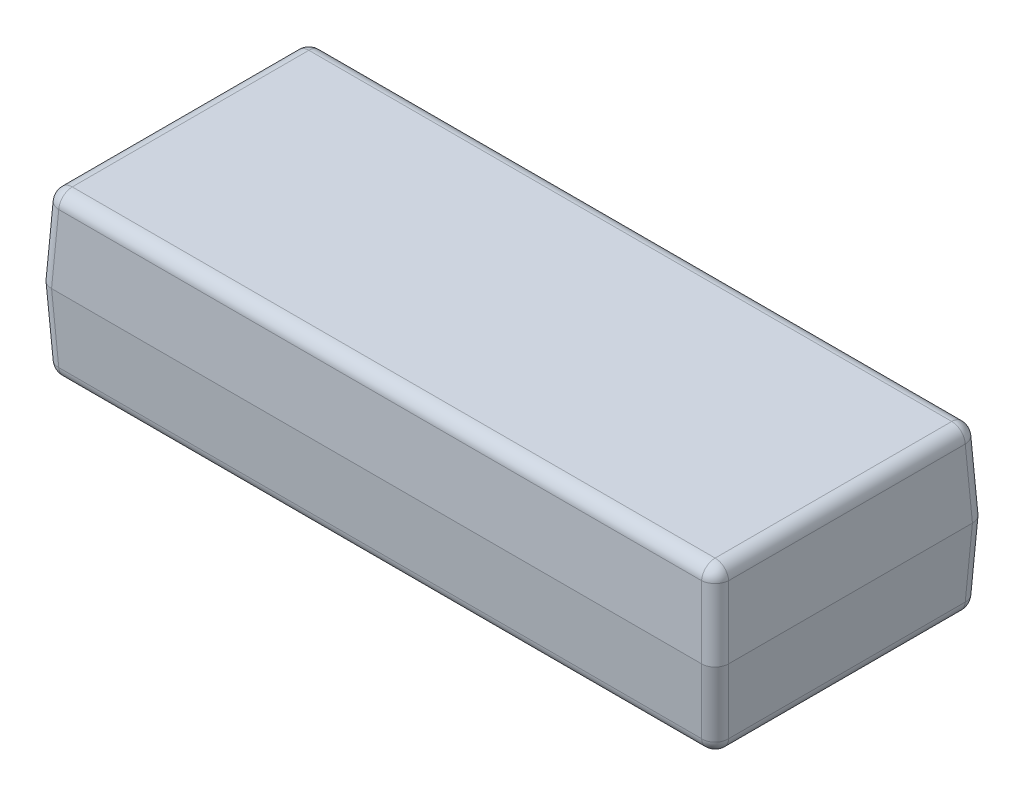
ISO-10303-21;
HEADER;
FILE_DESCRIPTION(('STEP AP214'),'2;1');
FILE_NAME('part.step','',(''),(''),'','','');
FILE_SCHEMA(('AUTOMOTIVE_DESIGN { 1 0 10303 214 1 1 1 1 }'));
ENDSEC;
DATA;
#1=APPLICATION_CONTEXT('core data for automotive mechanical design processes');
#2=APPLICATION_PROTOCOL_DEFINITION('international standard','automotive_design',2000,#1);
#3=PRODUCT_CONTEXT('',#1,'mechanical');
#4=PRODUCT('Part','Part','',(#3));
#5=PRODUCT_RELATED_PRODUCT_CATEGORY('part','',(#4));
#6=PRODUCT_DEFINITION_FORMATION('','',#4);
#7=PRODUCT_DEFINITION_CONTEXT('part definition',#1,'design');
#8=PRODUCT_DEFINITION('design','',#6,#7);
#9=PRODUCT_DEFINITION_SHAPE('','',#8);
#10=(LENGTH_UNIT() NAMED_UNIT(*) SI_UNIT(.MILLI.,.METRE.));
#11=(NAMED_UNIT(*) PLANE_ANGLE_UNIT() SI_UNIT($,.RADIAN.));
#12=(NAMED_UNIT(*) SI_UNIT($,.STERADIAN.) SOLID_ANGLE_UNIT());
#13=UNCERTAINTY_MEASURE_WITH_UNIT(LENGTH_MEASURE(1.E-05),#10,'distance_accuracy_value','');
#14=(GEOMETRIC_REPRESENTATION_CONTEXT(3) GLOBAL_UNCERTAINTY_ASSIGNED_CONTEXT((#13)) GLOBAL_UNIT_ASSIGNED_CONTEXT((#10,
#11,#12)) REPRESENTATION_CONTEXT('',''));
#15=CARTESIAN_POINT('',(0.,0.,0.));
#16=DIRECTION('',(0.,0.,1.));
#17=DIRECTION('',(1.,0.,0.));
#18=AXIS2_PLACEMENT_3D('',#15,#16,#17);
#19=CARTESIAN_POINT('',(62.5,0.,25.));
#20=DIRECTION('',(0.998629534754574,-0.0523359562429439,0.));
#21=DIRECTION('',(0.0523359562429439,0.998629534754574,0.));
#22=AXIS2_PLACEMENT_3D('',#19,#20,#21);
#23=PLANE('',#22);
#24=DIRECTION('',(0.,0.,1.));
#25=VECTOR('',#24,1.);
#26=CARTESIAN_POINT('',(62.5,0.,25.));
#27=LINE('',#26,#25);
#28=CARTESIAN_POINT('',(62.5,0.,-22.5034261631136));
#29=VERTEX_POINT('',#28);
#30=CARTESIAN_POINT('',(62.5,0.,22.5034261631136));
#31=VERTEX_POINT('',#30);
#32=EDGE_CURVE('E216',#29,#31,#27,.T.);
#33=ORIENTED_EDGE('',*,*,#32,.T.);
#34=DIRECTION('',(-0.052264427688714,-0.997264688634237,-0.052264427688714));
#35=VECTOR('',#34,1.);
#36=CARTESIAN_POINT('',(62.5068195671983,0.130125093862289,22.5102457303119));
#37=LINE('',#36,#35);
#38=CARTESIAN_POINT('',(61.8380457308536,-12.6308398906074,21.8414718939672));
#39=VERTEX_POINT('',#38);
#40=EDGE_CURVE('E12',#31,#39,#37,.T.);
#41=ORIENTED_EDGE('',*,*,#40,.T.);
#42=DIRECTION('',(0.,0.,1.));
#43=VECTOR('',#42,1.);
#44=CARTESIAN_POINT('',(61.8380457308536,-12.6308398906074,-24.2138833107544));
#45=LINE('',#44,#43);
#46=CARTESIAN_POINT('',(61.8380457308536,-12.6308398906074,-21.8414718939672));
#47=VERTEX_POINT('',#46);
#48=EDGE_CURVE('E54',#39,#47,#45,.F.);
#49=ORIENTED_EDGE('',*,*,#48,.T.);
#50=DIRECTION('',(-0.052264427688714,-0.997264688634237,0.052264427688714));
#51=VECTOR('',#50,1.);
#52=CARTESIAN_POINT('',(62.3702410471169,-2.47594831641931,-22.3736672102304));
#53=LINE('',#52,#51);
#54=EDGE_CURVE('E179',#47,#29,#53,.F.);
#55=ORIENTED_EDGE('',*,*,#54,.T.);
#56=EDGE_LOOP('',(#33,#41,#49,#55));
#57=FACE_BOUND('',#56,.T.);
#58=ADVANCED_FACE('F45',(#57),#23,.T.);
#59=CARTESIAN_POINT('',(-62.5,0.,25.));
#60=DIRECTION('',(0.,-0.0523359562429439,0.998629534754574));
#61=DIRECTION('',(0.,-0.998629534754574,-0.0523359562429439));
#62=AXIS2_PLACEMENT_3D('',#59,#60,#61);
#63=PLANE('',#62);
#64=DIRECTION('',(-1.,0.,0.));
#65=VECTOR('',#64,1.);
#66=CARTESIAN_POINT('',(-62.5,0.,25.));
#67=LINE('',#66,#65);
#68=CARTESIAN_POINT('',(60.0034261631136,0.,25.));
#69=VERTEX_POINT('',#68);
#70=CARTESIAN_POINT('',(-60.0034261631136,0.,25.));
#71=VERTEX_POINT('',#70);
#72=EDGE_CURVE('E151',#69,#71,#67,.T.);
#73=ORIENTED_EDGE('',*,*,#72,.T.);
#74=DIRECTION('',(0.052264427688714,-0.997264688634237,-0.052264427688714));
#75=VECTOR('',#74,1.);
#76=CARTESIAN_POINT('',(-60.0102457303119,0.130125093862289,25.0068195671983));
#77=LINE('',#76,#75);
#78=CARTESIAN_POINT('',(-59.3414718939672,-12.6308398906074,24.3380457308536));
#79=VERTEX_POINT('',#78);
#80=EDGE_CURVE('E177',#71,#79,#77,.T.);
#81=ORIENTED_EDGE('',*,*,#80,.T.);
#82=DIRECTION('',(-1.,0.,0.));
#83=VECTOR('',#82,1.);
#84=CARTESIAN_POINT('',(61.7138833107544,-12.6308398906074,24.3380457308536));
#85=LINE('',#84,#83);
#86=CARTESIAN_POINT('',(59.3414718939672,-12.6308398906074,24.3380457308536));
#87=VERTEX_POINT('',#86);
#88=EDGE_CURVE('E175',#79,#87,#85,.F.);
#89=ORIENTED_EDGE('',*,*,#88,.T.);
#90=DIRECTION('',(-0.052264427688714,-0.997264688634237,-0.052264427688714));
#91=VECTOR('',#90,1.);
#92=CARTESIAN_POINT('',(59.6687994301083,-6.3850584318417,24.6653732669947));
#93=LINE('',#92,#91);
#94=EDGE_CURVE('E173',#87,#69,#93,.F.);
#95=ORIENTED_EDGE('',*,*,#94,.T.);
#96=EDGE_LOOP('',(#73,#81,#89,#95));
#97=FACE_BOUND('',#96,.T.);
#98=ADVANCED_FACE('F224',(#97),#63,.T.);
#99=CARTESIAN_POINT('',(-62.5,0.,25.));
#100=DIRECTION('',(-0.998629534754574,-0.0523359562429439,0.));
#101=DIRECTION('',(0.0523359562429439,-0.998629534754574,0.));
#102=AXIS2_PLACEMENT_3D('',#99,#100,#101);
#103=PLANE('',#102);
#104=DIRECTION('',(0.,0.,-1.));
#105=VECTOR('',#104,1.);
#106=CARTESIAN_POINT('',(-62.5,0.,25.));
#107=LINE('',#106,#105);
#108=CARTESIAN_POINT('',(-62.5,0.,22.5034261631136));
#109=VERTEX_POINT('',#108);
#110=CARTESIAN_POINT('',(-62.5,0.,-22.5034261631136));
#111=VERTEX_POINT('',#110);
#112=EDGE_CURVE('E148',#109,#111,#107,.T.);
#113=ORIENTED_EDGE('',*,*,#112,.T.);
#114=DIRECTION('',(0.052264427688714,-0.997264688634237,0.052264427688714));
#115=VECTOR('',#114,1.);
#116=CARTESIAN_POINT('',(-62.3702410471169,-2.47594831641931,-22.3736672102304));
#117=LINE('',#116,#115);
#118=CARTESIAN_POINT('',(-61.8380457308536,-12.6308398906074,-21.8414718939672));
#119=VERTEX_POINT('',#118);
#120=EDGE_CURVE('E126',#111,#119,#117,.T.);
#121=ORIENTED_EDGE('',*,*,#120,.T.);
#122=DIRECTION('',(0.,0.,-1.));
#123=VECTOR('',#122,1.);
#124=CARTESIAN_POINT('',(-61.8380457308536,-12.6308398906074,24.2138833107544));
#125=LINE('',#124,#123);
#126=CARTESIAN_POINT('',(-61.8380457308536,-12.6308398906074,21.8414718939672));
#127=VERTEX_POINT('',#126);
#128=EDGE_CURVE('E161',#119,#127,#125,.F.);
#129=ORIENTED_EDGE('',*,*,#128,.T.);
#130=DIRECTION('',(0.052264427688714,-0.997264688634237,-0.052264427688714));
#131=VECTOR('',#130,1.);
#132=CARTESIAN_POINT('',(-62.5068195671983,0.130125093862289,22.5102457303119));
#133=LINE('',#132,#131);
#134=EDGE_CURVE('E131',#127,#109,#133,.F.);
#135=ORIENTED_EDGE('',*,*,#134,.T.);
#136=EDGE_LOOP('',(#113,#121,#129,#135));
#137=FACE_BOUND('',#136,.T.);
#138=ADVANCED_FACE('F257',(#137),#103,.T.);
#139=CARTESIAN_POINT('',(-62.5,0.,-25.));
#140=DIRECTION('',(0.,-0.0523359562429439,-0.998629534754574));
#141=DIRECTION('',(0.,0.998629534754574,-0.0523359562429439));
#142=AXIS2_PLACEMENT_3D('',#139,#140,#141);
#143=PLANE('',#142);
#144=DIRECTION('',(1.,0.,0.));
#145=VECTOR('',#144,1.);
#146=CARTESIAN_POINT('',(-61.7138833107544,-12.6308398906074,-24.3380457308536));
#147=LINE('',#146,#145);
#148=CARTESIAN_POINT('',(59.3414718939672,-12.6308398906074,-24.3380457308536));
#149=VERTEX_POINT('',#148);
#150=CARTESIAN_POINT('',(-59.3414718939672,-12.6308398906074,-24.3380457308536));
#151=VERTEX_POINT('',#150);
#152=EDGE_CURVE('E140',#149,#151,#147,.F.);
#153=ORIENTED_EDGE('',*,*,#152,.T.);
#154=DIRECTION('',(0.052264427688714,-0.997264688634237,0.052264427688714));
#155=VECTOR('',#154,1.);
#156=CARTESIAN_POINT('',(-60.0102457303119,0.130125093862289,-25.0068195671983));
#157=LINE('',#156,#155);
#158=CARTESIAN_POINT('',(-60.0034261631136,0.,-25.));
#159=VERTEX_POINT('',#158);
#160=EDGE_CURVE('E125',#151,#159,#157,.F.);
#161=ORIENTED_EDGE('',*,*,#160,.T.);
#162=DIRECTION('',(1.,0.,0.));
#163=VECTOR('',#162,1.);
#164=CARTESIAN_POINT('',(-62.5,0.,-25.));
#165=LINE('',#164,#163);
#166=CARTESIAN_POINT('',(60.0034261631136,0.,-25.));
#167=VERTEX_POINT('',#166);
#168=EDGE_CURVE('E137',#159,#167,#165,.T.);
#169=ORIENTED_EDGE('',*,*,#168,.T.);
#170=DIRECTION('',(-0.052264427688714,-0.997264688634237,0.052264427688714));
#171=VECTOR('',#170,1.);
#172=CARTESIAN_POINT('',(59.6687994301083,-6.3850584318417,-24.6653732669947));
#173=LINE('',#172,#171);
#174=EDGE_CURVE('E147',#167,#149,#173,.T.);
#175=ORIENTED_EDGE('',*,*,#174,.T.);
#176=EDGE_LOOP('',(#153,#161,#169,#175));
#177=FACE_BOUND('',#176,.T.);
#178=ADVANCED_FACE('F136',(#177),#143,.T.);
#179=CARTESIAN_POINT('',(0.,-15.,0.));
#180=DIRECTION('',(0.,-1.,0.));
#181=DIRECTION('',(0.,0.,-1.));
#182=AXIS2_PLACEMENT_3D('',#179,#180,#181);
#183=PLANE('',#182);
#184=DIRECTION('',(1.,0.,0.));
#185=VECTOR('',#184,1.);
#186=CARTESIAN_POINT('',(-61.7138833107544,-15.,21.8414718939672));
#187=LINE('',#186,#185);
#188=CARTESIAN_POINT('',(59.3414718939672,-15.,21.8414718939672));
#189=VERTEX_POINT('',#188);
#190=CARTESIAN_POINT('',(-59.3414718939672,-15.,21.8414718939672));
#191=VERTEX_POINT('',#190);
#192=EDGE_CURVE('E168',#189,#191,#187,.F.);
#193=ORIENTED_EDGE('',*,*,#192,.T.);
#194=DIRECTION('',(0.,0.,1.));
#195=VECTOR('',#194,1.);
#196=CARTESIAN_POINT('',(-59.3414718939672,-15.,-24.2138833107544));
#197=LINE('',#196,#195);
#198=CARTESIAN_POINT('',(-59.3414718939672,-15.,-21.8414718939672));
#199=VERTEX_POINT('',#198);
#200=EDGE_CURVE('E170',#191,#199,#197,.F.);
#201=ORIENTED_EDGE('',*,*,#200,.T.);
#202=DIRECTION('',(-1.,0.,0.));
#203=VECTOR('',#202,1.);
#204=CARTESIAN_POINT('',(61.7138833107544,-15.,-21.8414718939672));
#205=LINE('',#204,#203);
#206=CARTESIAN_POINT('',(59.3414718939672,-15.,-21.8414718939672));
#207=VERTEX_POINT('',#206);
#208=EDGE_CURVE('E164',#199,#207,#205,.F.);
#209=ORIENTED_EDGE('',*,*,#208,.T.);
#210=DIRECTION('',(0.,0.,-1.));
#211=VECTOR('',#210,1.);
#212=CARTESIAN_POINT('',(59.3414718939672,-15.,24.2138833107544));
#213=LINE('',#212,#211);
#214=EDGE_CURVE('E166',#207,#189,#213,.F.);
#215=ORIENTED_EDGE('',*,*,#214,.T.);
#216=EDGE_LOOP('',(#193,#201,#209,#215));
#217=FACE_BOUND('',#216,.T.);
#218=ADVANCED_FACE('F264',(#217),#183,.T.);
#219=CARTESIAN_POINT('',(0.,0.,0.));
#220=DIRECTION('',(0.,-1.,0.));
#221=DIRECTION('',(0.,0.,-1.));
#222=AXIS2_PLACEMENT_3D('',#219,#220,#221);
#223=PLANE('',#222);
#224=ORIENTED_EDGE('',*,*,#168,.F.);
#225=CARTESIAN_POINT('',(-59.9965691350052,0.,-22.4965691350052));
#226=DIRECTION('',(0.,-1.,0.));
#227=DIRECTION('',(-0.707106781186548,0.,-0.707106781186548));
#228=AXIS2_PLACEMENT_3D('',#225,#226,#227);
#229=ELLIPSE('',#228,2.50685703453892,2.5);
#230=EDGE_CURVE('E121',#159,#111,#229,.F.);
#231=ORIENTED_EDGE('',*,*,#230,.T.);
#232=ORIENTED_EDGE('',*,*,#112,.F.);
#233=CARTESIAN_POINT('',(-59.9965691350052,0.,22.4965691350052));
#234=DIRECTION('',(0.,-1.,0.));
#235=DIRECTION('',(-0.707106781186548,0.,0.707106781186548));
#236=AXIS2_PLACEMENT_3D('',#233,#234,#235);
#237=ELLIPSE('',#236,2.50685703453892,2.5);
#238=EDGE_CURVE('E132',#109,#71,#237,.F.);
#239=ORIENTED_EDGE('',*,*,#238,.T.);
#240=ORIENTED_EDGE('',*,*,#72,.F.);
#241=CARTESIAN_POINT('',(59.9965691350052,0.,22.4965691350052));
#242=DIRECTION('',(0.,-1.,0.));
#243=DIRECTION('',(0.707106781186548,0.,0.707106781186548));
#244=AXIS2_PLACEMENT_3D('',#241,#242,#243);
#245=ELLIPSE('',#244,2.50685703453892,2.5);
#246=EDGE_CURVE('E157',#69,#31,#245,.F.);
#247=ORIENTED_EDGE('',*,*,#246,.T.);
#248=ORIENTED_EDGE('',*,*,#32,.F.);
#249=CARTESIAN_POINT('',(59.9965691350052,0.,-22.4965691350052));
#250=DIRECTION('',(0.,-1.,0.));
#251=DIRECTION('',(0.707106781186548,0.,-0.707106781186548));
#252=AXIS2_PLACEMENT_3D('',#249,#250,#251);
#253=ELLIPSE('',#252,2.50685703453892,2.5);
#254=EDGE_CURVE('E142',#29,#167,#253,.F.);
#255=ORIENTED_EDGE('',*,*,#254,.T.);
#256=EDGE_LOOP('',(#224,#231,#232,#239,#240,#247,#248,#255));
#257=FACE_BOUND('',#256,.T.);
#258=ADVANCED_FACE('F144',(#257),#223,.F.);
#259=CARTESIAN_POINT('',(59.6687994301083,-6.25421854123434,22.1687994301083));
#260=DIRECTION('',(0.052264427688714,0.997264688634237,0.052264427688714));
#261=DIRECTION('',(0.,-0.0523359562429439,0.998629534754574));
#262=AXIS2_PLACEMENT_3D('',#259,#260,#261);
#263=CYLINDRICAL_SURFACE('',#262,2.5);
#264=CARTESIAN_POINT('',(59.3414718939672,-12.5,21.8414718939672));
#265=DIRECTION('',(-0.0522644276887138,-0.997264688634237,-0.0522644276887138));
#266=DIRECTION('',(0.,0.0523359562429437,-0.998629534754574));
#267=AXIS2_PLACEMENT_3D('',#264,#265,#266);
#268=CIRCLE('',#267,2.5);
#269=EDGE_CURVE('E49',#39,#87,#268,.T.);
#270=ORIENTED_EDGE('',*,*,#269,.F.);
#271=ORIENTED_EDGE('',*,*,#40,.F.);
#272=ORIENTED_EDGE('',*,*,#246,.F.);
#273=ORIENTED_EDGE('',*,*,#94,.F.);
#274=EDGE_LOOP('',(#270,#271,#272,#273));
#275=FACE_BOUND('',#274,.T.);
#276=ADVANCED_FACE('F47',(#275),#263,.T.);
#277=CARTESIAN_POINT('',(59.3414718939672,-12.5,21.8414718939672));
#278=DIRECTION('',(0.,0.,1.));
#279=DIRECTION('',(1.,0.,0.));
#280=AXIS2_PLACEMENT_3D('',#277,#278,#279);
#281=SPHERICAL_SURFACE('',#280,2.5);
#282=CARTESIAN_POINT('',(59.3414718939672,-12.5,21.8414718939672));
#283=DIRECTION('',(0.,0.,1.));
#284=DIRECTION('',(1.,0.,0.));
#285=AXIS2_PLACEMENT_3D('',#282,#283,#284);
#286=CIRCLE('',#285,2.5);
#287=EDGE_CURVE('E207',#39,#189,#286,.F.);
#288=ORIENTED_EDGE('',*,*,#287,.F.);
#289=ORIENTED_EDGE('',*,*,#269,.T.);
#290=CARTESIAN_POINT('',(59.3414718939672,-12.5,21.8414718939672));
#291=DIRECTION('',(1.,0.,0.));
#292=DIRECTION('',(0.,0.,-1.));
#293=AXIS2_PLACEMENT_3D('',#290,#291,#292);
#294=CIRCLE('',#293,2.5);
#295=EDGE_CURVE('E209',#189,#87,#294,.F.);
#296=ORIENTED_EDGE('',*,*,#295,.F.);
#297=EDGE_LOOP('',(#288,#289,#296));
#298=FACE_BOUND('',#297,.T.);
#299=ADVANCED_FACE('F281',(#298),#281,.T.);
#300=CARTESIAN_POINT('',(-60.0102457303119,0.260964984469648,22.5102457303119));
#301=DIRECTION('',(-0.052264427688714,0.997264688634237,0.052264427688714));
#302=DIRECTION('',(0.,-0.0523359562429439,0.998629534754574));
#303=AXIS2_PLACEMENT_3D('',#300,#301,#302);
#304=CYLINDRICAL_SURFACE('',#303,2.5);
#305=ORIENTED_EDGE('',*,*,#238,.F.);
#306=ORIENTED_EDGE('',*,*,#134,.F.);
#307=CARTESIAN_POINT('',(-59.3414718939672,-12.5,21.8414718939672));
#308=DIRECTION('',(0.0522644276887139,-0.997264688634237,-0.0522644276887139));
#309=DIRECTION('',(0.998629534754574,0.0523359562429438,0.));
#310=AXIS2_PLACEMENT_3D('',#307,#308,#309);
#311=CIRCLE('',#310,2.5);
#312=EDGE_CURVE('E204',#79,#127,#311,.T.);
#313=ORIENTED_EDGE('',*,*,#312,.F.);
#314=ORIENTED_EDGE('',*,*,#80,.F.);
#315=EDGE_LOOP('',(#305,#306,#313,#314));
#316=FACE_BOUND('',#315,.T.);
#317=ADVANCED_FACE('F230',(#316),#304,.T.);
#318=CARTESIAN_POINT('',(0.,-12.5,21.8414718939672));
#319=DIRECTION('',(-1.,0.,0.));
#320=DIRECTION('',(0.,0.,1.));
#321=AXIS2_PLACEMENT_3D('',#318,#319,#320);
#322=CYLINDRICAL_SURFACE('',#321,2.5);
#323=ORIENTED_EDGE('',*,*,#295,.T.);
#324=ORIENTED_EDGE('',*,*,#88,.F.);
#325=CARTESIAN_POINT('',(-59.3414718939672,-12.5,21.8414718939672));
#326=DIRECTION('',(-1.,0.,0.));
#327=DIRECTION('',(0.,0.,1.));
#328=AXIS2_PLACEMENT_3D('',#325,#326,#327);
#329=CIRCLE('',#328,2.5);
#330=EDGE_CURVE('E201',#191,#79,#329,.T.);
#331=ORIENTED_EDGE('',*,*,#330,.F.);
#332=ORIENTED_EDGE('',*,*,#192,.F.);
#333=EDGE_LOOP('',(#323,#324,#331,#332));
#334=FACE_BOUND('',#333,.T.);
#335=ADVANCED_FACE('F237',(#334),#322,.T.);
#336=CARTESIAN_POINT('',(59.3414718939672,-12.5,0.));
#337=DIRECTION('',(0.,0.,1.));
#338=DIRECTION('',(1.,0.,0.));
#339=AXIS2_PLACEMENT_3D('',#336,#337,#338);
#340=CYLINDRICAL_SURFACE('',#339,2.5);
#341=ORIENTED_EDGE('',*,*,#287,.T.);
#342=ORIENTED_EDGE('',*,*,#214,.F.);
#343=CARTESIAN_POINT('',(59.3414718939672,-12.5,-21.8414718939672));
#344=DIRECTION('',(0.,0.,-1.));
#345=DIRECTION('',(-1.,0.,0.));
#346=AXIS2_PLACEMENT_3D('',#343,#344,#345);
#347=CIRCLE('',#346,2.5);
#348=EDGE_CURVE('E198',#47,#207,#347,.T.);
#349=ORIENTED_EDGE('',*,*,#348,.F.);
#350=ORIENTED_EDGE('',*,*,#48,.F.);
#351=EDGE_LOOP('',(#341,#342,#349,#350));
#352=FACE_BOUND('',#351,.T.);
#353=ADVANCED_FACE('F280',(#352),#340,.T.);
#354=CARTESIAN_POINT('',(59.8736672102304,-2.34510842581195,-22.3736672102304));
#355=DIRECTION('',(0.052264427688714,0.997264688634237,-0.052264427688714));
#356=DIRECTION('',(0.,0.0523359562429439,0.998629534754574));
#357=AXIS2_PLACEMENT_3D('',#354,#355,#356);
#358=CYLINDRICAL_SURFACE('',#357,2.5);
#359=ORIENTED_EDGE('',*,*,#254,.F.);
#360=ORIENTED_EDGE('',*,*,#54,.F.);
#361=CARTESIAN_POINT('',(59.3414718939672,-12.5,-21.8414718939672));
#362=DIRECTION('',(-0.0522644276887138,-0.997264688634237,0.0522644276887138));
#363=DIRECTION('',(0.,-0.0523359562429438,-0.998629534754574));
#364=AXIS2_PLACEMENT_3D('',#361,#362,#363);
#365=CIRCLE('',#364,2.5);
#366=EDGE_CURVE('E195',#149,#47,#365,.T.);
#367=ORIENTED_EDGE('',*,*,#366,.F.);
#368=ORIENTED_EDGE('',*,*,#174,.F.);
#369=EDGE_LOOP('',(#359,#360,#367,#368));
#370=FACE_BOUND('',#369,.T.);
#371=ADVANCED_FACE('F240',(#370),#358,.T.);
#372=CARTESIAN_POINT('',(-59.3414718939672,-12.5,21.8414718939672));
#373=DIRECTION('',(0.,0.,1.));
#374=DIRECTION('',(1.,0.,0.));
#375=AXIS2_PLACEMENT_3D('',#372,#373,#374);
#376=SPHERICAL_SURFACE('',#375,2.5);
#377=ORIENTED_EDGE('',*,*,#330,.T.);
#378=ORIENTED_EDGE('',*,*,#312,.T.);
#379=CARTESIAN_POINT('',(-59.3414718939672,-12.5,21.8414718939672));
#380=DIRECTION('',(0.,0.,1.));
#381=DIRECTION('',(0.,-1.,0.));
#382=AXIS2_PLACEMENT_3D('',#379,#380,#381);
#383=CIRCLE('',#382,2.5);
#384=EDGE_CURVE('E192',#191,#127,#383,.F.);
#385=ORIENTED_EDGE('',*,*,#384,.F.);
#386=EDGE_LOOP('',(#377,#378,#385));
#387=FACE_BOUND('',#386,.T.);
#388=ADVANCED_FACE('F235',(#387),#376,.T.);
#389=CARTESIAN_POINT('',(59.3414718939672,-12.5,-21.8414718939672));
#390=DIRECTION('',(0.,0.,1.));
#391=DIRECTION('',(1.,0.,0.));
#392=AXIS2_PLACEMENT_3D('',#389,#390,#391);
#393=SPHERICAL_SURFACE('',#392,2.5);
#394=ORIENTED_EDGE('',*,*,#366,.T.);
#395=ORIENTED_EDGE('',*,*,#348,.T.);
#396=CARTESIAN_POINT('',(59.3414718939672,-12.5,-21.8414718939672));
#397=DIRECTION('',(1.,0.,0.));
#398=DIRECTION('',(0.,0.,-1.));
#399=AXIS2_PLACEMENT_3D('',#396,#397,#398);
#400=CIRCLE('',#399,2.5);
#401=EDGE_CURVE('E189',#149,#207,#400,.F.);
#402=ORIENTED_EDGE('',*,*,#401,.F.);
#403=EDGE_LOOP('',(#394,#395,#402));
#404=FACE_BOUND('',#403,.T.);
#405=ADVANCED_FACE('F245',(#404),#393,.T.);
#406=CARTESIAN_POINT('',(-59.3414718939672,-12.5,0.));
#407=DIRECTION('',(0.,0.,-1.));
#408=DIRECTION('',(-1.,0.,0.));
#409=AXIS2_PLACEMENT_3D('',#406,#407,#408);
#410=CYLINDRICAL_SURFACE('',#409,2.5);
#411=ORIENTED_EDGE('',*,*,#384,.T.);
#412=ORIENTED_EDGE('',*,*,#128,.F.);
#413=CARTESIAN_POINT('',(-59.3414718939672,-12.5,-21.8414718939672));
#414=DIRECTION('',(0.,0.,-1.));
#415=DIRECTION('',(-1.,0.,0.));
#416=AXIS2_PLACEMENT_3D('',#413,#414,#415);
#417=CIRCLE('',#416,2.5);
#418=EDGE_CURVE('E186',#199,#119,#417,.T.);
#419=ORIENTED_EDGE('',*,*,#418,.F.);
#420=ORIENTED_EDGE('',*,*,#200,.F.);
#421=EDGE_LOOP('',(#411,#412,#419,#420));
#422=FACE_BOUND('',#421,.T.);
#423=ADVANCED_FACE('F255',(#422),#410,.T.);
#424=CARTESIAN_POINT('',(0.,-12.5,-21.8414718939672));
#425=DIRECTION('',(1.,0.,0.));
#426=DIRECTION('',(0.,0.,-1.));
#427=AXIS2_PLACEMENT_3D('',#424,#425,#426);
#428=CYLINDRICAL_SURFACE('',#427,2.5);
#429=ORIENTED_EDGE('',*,*,#401,.T.);
#430=ORIENTED_EDGE('',*,*,#208,.F.);
#431=CARTESIAN_POINT('',(-59.3414718939672,-12.5,-21.8414718939672));
#432=DIRECTION('',(-1.,0.,0.));
#433=DIRECTION('',(0.,0.,1.));
#434=AXIS2_PLACEMENT_3D('',#431,#432,#433);
#435=CIRCLE('',#434,2.5);
#436=EDGE_CURVE('E184',#151,#199,#435,.T.);
#437=ORIENTED_EDGE('',*,*,#436,.F.);
#438=ORIENTED_EDGE('',*,*,#152,.F.);
#439=EDGE_LOOP('',(#429,#430,#437,#438));
#440=FACE_BOUND('',#439,.T.);
#441=ADVANCED_FACE('F248',(#440),#428,.T.);
#442=CARTESIAN_POINT('',(-59.3414718939672,-12.5,-21.8414718939672));
#443=DIRECTION('',(0.,0.,1.));
#444=DIRECTION('',(1.,0.,0.));
#445=AXIS2_PLACEMENT_3D('',#442,#443,#444);
#446=SPHERICAL_SURFACE('',#445,2.5);
#447=ORIENTED_EDGE('',*,*,#436,.T.);
#448=ORIENTED_EDGE('',*,*,#418,.T.);
#449=CARTESIAN_POINT('',(-59.3414718939672,-12.5,-21.8414718939672));
#450=DIRECTION('',(0.0522644276887138,-0.997264688634237,0.0522644276887138));
#451=DIRECTION('',(0.,-0.0523359562429438,-0.998629534754574));
#452=AXIS2_PLACEMENT_3D('',#449,#450,#451);
#453=CIRCLE('',#452,2.5);
#454=EDGE_CURVE('E182',#151,#119,#453,.F.);
#455=ORIENTED_EDGE('',*,*,#454,.F.);
#456=EDGE_LOOP('',(#447,#448,#455));
#457=FACE_BOUND('',#456,.T.);
#458=ADVANCED_FACE('F252',(#457),#446,.T.);
#459=CARTESIAN_POINT('',(-60.0102457303119,0.260964984469649,-22.5102457303119));
#460=DIRECTION('',(-0.052264427688714,0.997264688634237,-0.052264427688714));
#461=DIRECTION('',(0.,0.0523359562429439,0.998629534754574));
#462=AXIS2_PLACEMENT_3D('',#459,#460,#461);
#463=CYLINDRICAL_SURFACE('',#462,2.5);
#464=ORIENTED_EDGE('',*,*,#454,.T.);
#465=ORIENTED_EDGE('',*,*,#120,.F.);
#466=ORIENTED_EDGE('',*,*,#230,.F.);
#467=ORIENTED_EDGE('',*,*,#160,.F.);
#468=EDGE_LOOP('',(#464,#465,#466,#467));
#469=FACE_BOUND('',#468,.T.);
#470=ADVANCED_FACE('F124',(#469),#463,.T.);
#471=CLOSED_SHELL('',(#58,#98,#138,#178,#218,#258,#276,#299,#317,#335,#353,#371,#388,#405,#423,
#441,#458,#470));
#472=MANIFOLD_SOLID_BREP('B2',#471);
#473=CARTESIAN_POINT('',(62.5,0.,-25.));
#474=DIRECTION('',(0.998629534754574,0.0523359562429439,0.));
#475=DIRECTION('',(-0.0523359562429439,0.998629534754574,0.));
#476=AXIS2_PLACEMENT_3D('',#473,#474,#475);
#477=PLANE('',#476);
#478=DIRECTION('',(0.,0.,-1.));
#479=VECTOR('',#478,1.);
#480=CARTESIAN_POINT('',(61.8380457308536,12.6308398906074,24.2138833107544));
#481=LINE('',#480,#479);
#482=CARTESIAN_POINT('',(61.8380457308536,12.6308398906074,-21.8414718939672));
#483=VERTEX_POINT('',#482);
#484=CARTESIAN_POINT('',(61.8380457308536,12.6308398906074,21.8414718939672));
#485=VERTEX_POINT('',#484);
#486=EDGE_CURVE('E503',#483,#485,#481,.F.);
#487=ORIENTED_EDGE('',*,*,#486,.T.);
#488=DIRECTION('',(-0.052264427688714,0.997264688634237,-0.052264427688714));
#489=VECTOR('',#488,1.);
#490=CARTESIAN_POINT('',(62.3702410471169,2.47594831641931,22.3736672102304));
#491=LINE('',#490,#489);
#492=CARTESIAN_POINT('',(62.5,0.,22.5034261631136));
#493=VERTEX_POINT('',#492);
#494=EDGE_CURVE('E489',#485,#493,#491,.F.);
#495=ORIENTED_EDGE('',*,*,#494,.T.);
#496=DIRECTION('',(0.,0.,-1.));
#497=VECTOR('',#496,1.);
#498=CARTESIAN_POINT('',(62.5,0.,-25.));
#499=LINE('',#498,#497);
#500=CARTESIAN_POINT('',(62.5,0.,-22.5034261631136));
#501=VERTEX_POINT('',#500);
#502=EDGE_CURVE('E500',#493,#501,#499,.T.);
#503=ORIENTED_EDGE('',*,*,#502,.T.);
#504=DIRECTION('',(-0.052264427688714,0.997264688634237,0.052264427688714));
#505=VECTOR('',#504,1.);
#506=CARTESIAN_POINT('',(62.5068195671983,-0.130125093862289,-22.5102457303119));
#507=LINE('',#506,#505);
#508=EDGE_CURVE('E506',#501,#483,#507,.T.);
#509=ORIENTED_EDGE('',*,*,#508,.T.);
#510=EDGE_LOOP('',(#487,#495,#503,#509));
#511=FACE_BOUND('',#510,.T.);
#512=ADVANCED_FACE('F409',(#511),#477,.T.);
#513=CARTESIAN_POINT('',(-62.5,0.,-25.));
#514=DIRECTION('',(0.,0.0523359562429439,-0.998629534754574));
#515=DIRECTION('',(0.,0.998629534754574,0.0523359562429439));
#516=AXIS2_PLACEMENT_3D('',#513,#514,#515);
#517=PLANE('',#516);
#518=DIRECTION('',(-1.,0.,0.));
#519=VECTOR('',#518,1.);
#520=CARTESIAN_POINT('',(-62.5,0.,-25.));
#521=LINE('',#520,#519);
#522=CARTESIAN_POINT('',(60.0034261631136,0.,-25.));
#523=VERTEX_POINT('',#522);
#524=CARTESIAN_POINT('',(-60.0034261631136,0.,-25.));
#525=VERTEX_POINT('',#524);
#526=EDGE_CURVE('E511',#523,#525,#521,.T.);
#527=ORIENTED_EDGE('',*,*,#526,.T.);
#528=DIRECTION('',(0.052264427688714,0.997264688634237,0.052264427688714));
#529=VECTOR('',#528,1.);
#530=CARTESIAN_POINT('',(-60.0102457303119,-0.130125093862289,-25.0068195671983));
#531=LINE('',#530,#529);
#532=CARTESIAN_POINT('',(-59.3414718939672,12.6308398906074,-24.3380457308536));
#533=VERTEX_POINT('',#532);
#534=EDGE_CURVE('E543',#525,#533,#531,.T.);
#535=ORIENTED_EDGE('',*,*,#534,.T.);
#536=DIRECTION('',(-1.,0.,0.));
#537=VECTOR('',#536,1.);
#538=CARTESIAN_POINT('',(61.7138833107544,12.6308398906074,-24.3380457308536));
#539=LINE('',#538,#537);
#540=CARTESIAN_POINT('',(59.3414718939672,12.6308398906074,-24.3380457308536));
#541=VERTEX_POINT('',#540);
#542=EDGE_CURVE('E539',#533,#541,#539,.F.);
#543=ORIENTED_EDGE('',*,*,#542,.T.);
#544=DIRECTION('',(-0.052264427688714,0.997264688634237,0.052264427688714));
#545=VECTOR('',#544,1.);
#546=CARTESIAN_POINT('',(59.6687994301083,6.3850584318417,-24.6653732669947));
#547=LINE('',#546,#545);
#548=EDGE_CURVE('E541',#541,#523,#547,.F.);
#549=ORIENTED_EDGE('',*,*,#548,.T.);
#550=EDGE_LOOP('',(#527,#535,#543,#549));
#551=FACE_BOUND('',#550,.T.);
#552=ADVANCED_FACE('F613',(#551),#517,.T.);
#553=CARTESIAN_POINT('',(-62.5,0.,-25.));
#554=DIRECTION('',(-0.998629534754574,0.0523359562429439,0.));
#555=DIRECTION('',(-0.0523359562429439,-0.998629534754574,0.));
#556=AXIS2_PLACEMENT_3D('',#553,#554,#555);
#557=PLANE('',#556);
#558=DIRECTION('',(0.,0.,1.));
#559=VECTOR('',#558,1.);
#560=CARTESIAN_POINT('',(-61.8380457308536,12.6308398906074,-24.2138833107544));
#561=LINE('',#560,#559);
#562=CARTESIAN_POINT('',(-61.8380457308536,12.6308398906074,21.8414718939672));
#563=VERTEX_POINT('',#562);
#564=CARTESIAN_POINT('',(-61.8380457308536,12.6308398906074,-21.8414718939672));
#565=VERTEX_POINT('',#564);
#566=EDGE_CURVE('E533',#563,#565,#561,.F.);
#567=ORIENTED_EDGE('',*,*,#566,.T.);
#568=DIRECTION('',(0.052264427688714,0.997264688634237,0.052264427688714));
#569=VECTOR('',#568,1.);
#570=CARTESIAN_POINT('',(-62.5068195671983,-0.130125093862289,-22.5102457303119));
#571=LINE('',#570,#569);
#572=CARTESIAN_POINT('',(-62.5,0.,-22.5034261631136));
#573=VERTEX_POINT('',#572);
#574=EDGE_CURVE('E537',#565,#573,#571,.F.);
#575=ORIENTED_EDGE('',*,*,#574,.T.);
#576=DIRECTION('',(0.,0.,1.));
#577=VECTOR('',#576,1.);
#578=CARTESIAN_POINT('',(-62.5,0.,-25.));
#579=LINE('',#578,#577);
#580=CARTESIAN_POINT('',(-62.5,0.,22.5034261631136));
#581=VERTEX_POINT('',#580);
#582=EDGE_CURVE('E514',#573,#581,#579,.T.);
#583=ORIENTED_EDGE('',*,*,#582,.T.);
#584=DIRECTION('',(0.052264427688714,0.997264688634237,-0.052264427688714));
#585=VECTOR('',#584,1.);
#586=CARTESIAN_POINT('',(-62.3702410471169,2.47594831641931,22.3736672102304));
#587=LINE('',#586,#585);
#588=EDGE_CURVE('E535',#581,#563,#587,.T.);
#589=ORIENTED_EDGE('',*,*,#588,.T.);
#590=EDGE_LOOP('',(#567,#575,#583,#589));
#591=FACE_BOUND('',#590,.T.);
#592=ADVANCED_FACE('F620',(#591),#557,.T.);
#593=CARTESIAN_POINT('',(-62.5,0.,25.));
#594=DIRECTION('',(0.,0.0523359562429439,0.998629534754574));
#595=DIRECTION('',(0.,-0.998629534754574,0.0523359562429439));
#596=AXIS2_PLACEMENT_3D('',#593,#594,#595);
#597=PLANE('',#596);
#598=DIRECTION('',(1.,0.,0.));
#599=VECTOR('',#598,1.);
#600=CARTESIAN_POINT('',(-62.5,0.,25.));
#601=LINE('',#600,#599);
#602=CARTESIAN_POINT('',(-60.0034261631136,0.,25.));
#603=VERTEX_POINT('',#602);
#604=CARTESIAN_POINT('',(60.0034261631136,0.,25.));
#605=VERTEX_POINT('',#604);
#606=EDGE_CURVE('E521',#603,#605,#601,.T.);
#607=ORIENTED_EDGE('',*,*,#606,.T.);
#608=DIRECTION('',(-0.052264427688714,0.997264688634237,-0.052264427688714));
#609=VECTOR('',#608,1.);
#610=CARTESIAN_POINT('',(59.6687994301083,6.3850584318417,24.6653732669947));
#611=LINE('',#610,#609);
#612=CARTESIAN_POINT('',(59.3414718939672,12.6308398906074,24.3380457308536));
#613=VERTEX_POINT('',#612);
#614=EDGE_CURVE('E490',#605,#613,#611,.T.);
#615=ORIENTED_EDGE('',*,*,#614,.T.);
#616=DIRECTION('',(1.,0.,0.));
#617=VECTOR('',#616,1.);
#618=CARTESIAN_POINT('',(-61.7138833107544,12.6308398906074,24.3380457308536));
#619=LINE('',#618,#617);
#620=CARTESIAN_POINT('',(-59.3414718939672,12.6308398906074,24.3380457308536));
#621=VERTEX_POINT('',#620);
#622=EDGE_CURVE('E495',#613,#621,#619,.F.);
#623=ORIENTED_EDGE('',*,*,#622,.T.);
#624=DIRECTION('',(0.052264427688714,0.997264688634237,-0.052264427688714));
#625=VECTOR('',#624,1.);
#626=CARTESIAN_POINT('',(-60.0102457303119,-0.130125093862289,25.0068195671983));
#627=LINE('',#626,#625);
#628=EDGE_CURVE('E530',#621,#603,#627,.F.);
#629=ORIENTED_EDGE('',*,*,#628,.T.);
#630=EDGE_LOOP('',(#607,#615,#623,#629));
#631=FACE_BOUND('',#630,.T.);
#632=ADVANCED_FACE('F627',(#631),#597,.T.);
#633=CARTESIAN_POINT('',(0.,15.,0.));
#634=DIRECTION('',(0.,1.,0.));
#635=DIRECTION('',(0.,0.,1.));
#636=AXIS2_PLACEMENT_3D('',#633,#634,#635);
#637=PLANE('',#636);
#638=DIRECTION('',(0.,0.,1.));
#639=VECTOR('',#638,1.);
#640=CARTESIAN_POINT('',(59.3414718939672,15.,-24.2138833107544));
#641=LINE('',#640,#639);
#642=CARTESIAN_POINT('',(59.3414718939672,15.,21.8414718939672));
#643=VERTEX_POINT('',#642);
#644=CARTESIAN_POINT('',(59.3414718939672,15.,-21.8414718939672));
#645=VERTEX_POINT('',#644);
#646=EDGE_CURVE('E418',#643,#645,#641,.F.);
#647=ORIENTED_EDGE('',*,*,#646,.T.);
#648=DIRECTION('',(1.,0.,0.));
#649=VECTOR('',#648,1.);
#650=CARTESIAN_POINT('',(-61.7138833107544,15.,-21.8414718939672));
#651=LINE('',#650,#649);
#652=CARTESIAN_POINT('',(-59.3414718939672,15.,-21.8414718939672));
#653=VERTEX_POINT('',#652);
#654=EDGE_CURVE('E43',#645,#653,#651,.F.);
#655=ORIENTED_EDGE('',*,*,#654,.T.);
#656=DIRECTION('',(0.,0.,-1.));
#657=VECTOR('',#656,1.);
#658=CARTESIAN_POINT('',(-59.3414718939672,15.,24.2138833107544));
#659=LINE('',#658,#657);
#660=CARTESIAN_POINT('',(-59.3414718939672,15.,21.8414718939672));
#661=VERTEX_POINT('',#660);
#662=EDGE_CURVE('E545',#653,#661,#659,.F.);
#663=ORIENTED_EDGE('',*,*,#662,.T.);
#664=DIRECTION('',(-1.,0.,0.));
#665=VECTOR('',#664,1.);
#666=CARTESIAN_POINT('',(61.7138833107544,15.,21.8414718939672));
#667=LINE('',#666,#665);
#668=EDGE_CURVE('E429',#661,#643,#667,.F.);
#669=ORIENTED_EDGE('',*,*,#668,.T.);
#670=EDGE_LOOP('',(#647,#655,#663,#669));
#671=FACE_BOUND('',#670,.T.);
#672=ADVANCED_FACE('F592',(#671),#637,.T.);
#673=CARTESIAN_POINT('',(0.,0.,0.));
#674=DIRECTION('',(0.,1.,0.));
#675=DIRECTION('',(0.,0.,1.));
#676=AXIS2_PLACEMENT_3D('',#673,#674,#675);
#677=PLANE('',#676);
#678=ORIENTED_EDGE('',*,*,#502,.F.);
#679=CARTESIAN_POINT('',(59.9965691350052,0.,22.4965691350052));
#680=DIRECTION('',(0.,1.,0.));
#681=DIRECTION('',(0.707106781186548,0.,0.707106781186548));
#682=AXIS2_PLACEMENT_3D('',#679,#680,#681);
#683=ELLIPSE('',#682,2.50685703453892,2.5);
#684=EDGE_CURVE('E485',#493,#605,#683,.F.);
#685=ORIENTED_EDGE('',*,*,#684,.T.);
#686=ORIENTED_EDGE('',*,*,#606,.F.);
#687=CARTESIAN_POINT('',(-59.9965691350052,0.,22.4965691350052));
#688=DIRECTION('',(0.,1.,0.));
#689=DIRECTION('',(-0.707106781186548,0.,0.707106781186548));
#690=AXIS2_PLACEMENT_3D('',#687,#688,#689);
#691=ELLIPSE('',#690,2.50685703453892,2.5);
#692=EDGE_CURVE('E526',#603,#581,#691,.F.);
#693=ORIENTED_EDGE('',*,*,#692,.T.);
#694=ORIENTED_EDGE('',*,*,#582,.F.);
#695=CARTESIAN_POINT('',(-59.9965691350052,0.,-22.4965691350052));
#696=DIRECTION('',(0.,1.,0.));
#697=DIRECTION('',(-0.707106781186548,0.,-0.707106781186548));
#698=AXIS2_PLACEMENT_3D('',#695,#696,#697);
#699=ELLIPSE('',#698,2.50685703453892,2.5);
#700=EDGE_CURVE('E496',#573,#525,#699,.F.);
#701=ORIENTED_EDGE('',*,*,#700,.T.);
#702=ORIENTED_EDGE('',*,*,#526,.F.);
#703=CARTESIAN_POINT('',(59.9965691350052,0.,-22.4965691350052));
#704=DIRECTION('',(0.,1.,0.));
#705=DIRECTION('',(0.707106781186548,0.,-0.707106781186548));
#706=AXIS2_PLACEMENT_3D('',#703,#704,#705);
#707=ELLIPSE('',#706,2.50685703453892,2.5);
#708=EDGE_CURVE('E505',#523,#501,#707,.F.);
#709=ORIENTED_EDGE('',*,*,#708,.T.);
#710=EDGE_LOOP('',(#678,#685,#686,#693,#694,#701,#702,#709));
#711=FACE_BOUND('',#710,.T.);
#712=ADVANCED_FACE('F508',(#711),#677,.F.);
#713=CARTESIAN_POINT('',(-60.0102457303119,-0.260964984469648,-22.5102457303119));
#714=DIRECTION('',(-0.052264427688714,-0.997264688634237,-0.052264427688714));
#715=DIRECTION('',(0.,0.0523359562429439,-0.998629534754574));
#716=AXIS2_PLACEMENT_3D('',#713,#714,#715);
#717=CYLINDRICAL_SURFACE('',#716,2.5);
#718=CARTESIAN_POINT('',(-59.3414718939672,12.5,-21.8414718939672));
#719=DIRECTION('',(0.0522644276887139,0.997264688634237,0.0522644276887139));
#720=DIRECTION('',(-0.998629534754574,0.0523359562429438,0.));
#721=AXIS2_PLACEMENT_3D('',#718,#719,#720);
#722=CIRCLE('',#721,2.5);
#723=EDGE_CURVE('E413',#533,#565,#722,.T.);
#724=ORIENTED_EDGE('',*,*,#723,.F.);
#725=ORIENTED_EDGE('',*,*,#534,.F.);
#726=ORIENTED_EDGE('',*,*,#700,.F.);
#727=ORIENTED_EDGE('',*,*,#574,.F.);
#728=EDGE_LOOP('',(#724,#725,#726,#727));
#729=FACE_BOUND('',#728,.T.);
#730=ADVANCED_FACE('F411',(#729),#717,.T.);
#731=CARTESIAN_POINT('',(-59.3414718939672,12.5,-21.8414718939672));
#732=DIRECTION('',(0.,0.,1.));
#733=DIRECTION('',(1.,0.,0.));
#734=AXIS2_PLACEMENT_3D('',#731,#732,#733);
#735=SPHERICAL_SURFACE('',#734,2.5);
#736=CARTESIAN_POINT('',(-59.3414718939672,12.5,-21.8414718939672));
#737=DIRECTION('',(-1.,0.,0.));
#738=DIRECTION('',(0.,0.,1.));
#739=AXIS2_PLACEMENT_3D('',#736,#737,#738);
#740=CIRCLE('',#739,2.5);
#741=EDGE_CURVE('E575',#533,#653,#740,.F.);
#742=ORIENTED_EDGE('',*,*,#741,.F.);
#743=ORIENTED_EDGE('',*,*,#723,.T.);
#744=CARTESIAN_POINT('',(-59.3414718939672,12.5,-21.8414718939672));
#745=DIRECTION('',(0.,0.,-1.));
#746=DIRECTION('',(0.,1.,0.));
#747=AXIS2_PLACEMENT_3D('',#744,#745,#746);
#748=CIRCLE('',#747,2.5);
#749=EDGE_CURVE('E517',#653,#565,#748,.F.);
#750=ORIENTED_EDGE('',*,*,#749,.F.);
#751=EDGE_LOOP('',(#742,#743,#750));
#752=FACE_BOUND('',#751,.T.);
#753=ADVANCED_FACE('F586',(#752),#735,.T.);
#754=CARTESIAN_POINT('',(-60.0102457303119,-0.260964984469649,22.5102457303119));
#755=DIRECTION('',(-0.052264427688714,-0.997264688634237,0.052264427688714));
#756=DIRECTION('',(0.,-0.0523359562429439,-0.998629534754574));
#757=AXIS2_PLACEMENT_3D('',#754,#755,#756);
#758=CYLINDRICAL_SURFACE('',#757,2.5);
#759=ORIENTED_EDGE('',*,*,#692,.F.);
#760=ORIENTED_EDGE('',*,*,#628,.F.);
#761=CARTESIAN_POINT('',(-59.3414718939672,12.5,21.8414718939672));
#762=DIRECTION('',(0.0522644276887138,0.997264688634237,-0.0522644276887138));
#763=DIRECTION('',(0.,0.0523359562429438,0.998629534754574));
#764=AXIS2_PLACEMENT_3D('',#761,#762,#763);
#765=CIRCLE('',#764,2.5);
#766=EDGE_CURVE('E572',#563,#621,#765,.T.);
#767=ORIENTED_EDGE('',*,*,#766,.F.);
#768=ORIENTED_EDGE('',*,*,#588,.F.);
#769=EDGE_LOOP('',(#759,#760,#767,#768));
#770=FACE_BOUND('',#769,.T.);
#771=ADVANCED_FACE('F624',(#770),#758,.T.);
#772=CARTESIAN_POINT('',(-59.3414718939672,12.5,0.));
#773=DIRECTION('',(0.,0.,1.));
#774=DIRECTION('',(1.,0.,0.));
#775=AXIS2_PLACEMENT_3D('',#772,#773,#774);
#776=CYLINDRICAL_SURFACE('',#775,2.5);
#777=ORIENTED_EDGE('',*,*,#749,.T.);
#778=ORIENTED_EDGE('',*,*,#566,.F.);
#779=CARTESIAN_POINT('',(-59.3414718939672,12.5,21.8414718939672));
#780=DIRECTION('',(0.,0.,1.));
#781=DIRECTION('',(1.,0.,0.));
#782=AXIS2_PLACEMENT_3D('',#779,#780,#781);
#783=CIRCLE('',#782,2.5);
#784=EDGE_CURVE('E569',#661,#563,#783,.T.);
#785=ORIENTED_EDGE('',*,*,#784,.F.);
#786=ORIENTED_EDGE('',*,*,#662,.F.);
#787=EDGE_LOOP('',(#777,#778,#785,#786));
#788=FACE_BOUND('',#787,.T.);
#789=ADVANCED_FACE('F581',(#788),#776,.T.);
#790=CARTESIAN_POINT('',(0.,12.5,-21.8414718939672));
#791=DIRECTION('',(-1.,0.,0.));
#792=DIRECTION('',(0.,0.,1.));
#793=AXIS2_PLACEMENT_3D('',#790,#791,#792);
#794=CYLINDRICAL_SURFACE('',#793,2.5);
#795=ORIENTED_EDGE('',*,*,#741,.T.);
#796=ORIENTED_EDGE('',*,*,#654,.F.);
#797=CARTESIAN_POINT('',(59.3414718939672,12.5,-21.8414718939672));
#798=DIRECTION('',(1.,0.,0.));
#799=DIRECTION('',(0.,1.,0.));
#800=AXIS2_PLACEMENT_3D('',#797,#798,#799);
#801=CIRCLE('',#800,2.5);
#802=EDGE_CURVE('E566',#541,#645,#801,.T.);
#803=ORIENTED_EDGE('',*,*,#802,.F.);
#804=ORIENTED_EDGE('',*,*,#542,.F.);
#805=EDGE_LOOP('',(#795,#796,#803,#804));
#806=FACE_BOUND('',#805,.T.);
#807=ADVANCED_FACE('F590',(#806),#794,.T.);
#808=CARTESIAN_POINT('',(59.6687994301083,6.25421854123434,-22.1687994301083));
#809=DIRECTION('',(0.052264427688714,-0.997264688634237,-0.052264427688714));
#810=DIRECTION('',(0.,0.0523359562429439,-0.998629534754574));
#811=AXIS2_PLACEMENT_3D('',#808,#809,#810);
#812=CYLINDRICAL_SURFACE('',#811,2.5);
#813=ORIENTED_EDGE('',*,*,#708,.F.);
#814=ORIENTED_EDGE('',*,*,#548,.F.);
#815=CARTESIAN_POINT('',(59.3414718939672,12.5,-21.8414718939672));
#816=DIRECTION('',(-0.0522644276887138,0.997264688634237,0.0522644276887136));
#817=DIRECTION('',(-0.998629534754574,-0.0523359562429437,0.));
#818=AXIS2_PLACEMENT_3D('',#815,#816,#817);
#819=CIRCLE('',#818,2.5);
#820=EDGE_CURVE('E563',#483,#541,#819,.T.);
#821=ORIENTED_EDGE('',*,*,#820,.F.);
#822=ORIENTED_EDGE('',*,*,#508,.F.);
#823=EDGE_LOOP('',(#813,#814,#821,#822));
#824=FACE_BOUND('',#823,.T.);
#825=ADVANCED_FACE('F611',(#824),#812,.T.);
#826=CARTESIAN_POINT('',(-59.3414718939672,12.5,21.8414718939672));
#827=DIRECTION('',(0.,0.,1.));
#828=DIRECTION('',(1.,0.,0.));
#829=AXIS2_PLACEMENT_3D('',#826,#827,#828);
#830=SPHERICAL_SURFACE('',#829,2.5);
#831=ORIENTED_EDGE('',*,*,#784,.T.);
#832=ORIENTED_EDGE('',*,*,#766,.T.);
#833=CARTESIAN_POINT('',(-59.3414718939672,12.5,21.8414718939672));
#834=DIRECTION('',(-1.,0.,0.));
#835=DIRECTION('',(0.,0.,1.));
#836=AXIS2_PLACEMENT_3D('',#833,#834,#835);
#837=CIRCLE('',#836,2.5);
#838=EDGE_CURVE('E560',#661,#621,#837,.F.);
#839=ORIENTED_EDGE('',*,*,#838,.F.);
#840=EDGE_LOOP('',(#831,#832,#839));
#841=FACE_BOUND('',#840,.T.);
#842=ADVANCED_FACE('F595',(#841),#830,.T.);
#843=CARTESIAN_POINT('',(59.3414718939672,12.5,-21.8414718939672));
#844=DIRECTION('',(0.,0.,1.));
#845=DIRECTION('',(1.,0.,0.));
#846=AXIS2_PLACEMENT_3D('',#843,#844,#845);
#847=SPHERICAL_SURFACE('',#846,2.5);
#848=ORIENTED_EDGE('',*,*,#820,.T.);
#849=ORIENTED_EDGE('',*,*,#802,.T.);
#850=CARTESIAN_POINT('',(59.3414718939672,12.5,-21.8414718939672));
#851=DIRECTION('',(0.,0.,-1.));
#852=DIRECTION('',(-1.,0.,0.));
#853=AXIS2_PLACEMENT_3D('',#850,#851,#852);
#854=CIRCLE('',#853,2.5);
#855=EDGE_CURVE('E557',#483,#645,#854,.F.);
#856=ORIENTED_EDGE('',*,*,#855,.F.);
#857=EDGE_LOOP('',(#848,#849,#856));
#858=FACE_BOUND('',#857,.T.);
#859=ADVANCED_FACE('F607',(#858),#847,.T.);
#860=CARTESIAN_POINT('',(0.,12.5,21.8414718939672));
#861=DIRECTION('',(1.,0.,0.));
#862=DIRECTION('',(0.,0.,-1.));
#863=AXIS2_PLACEMENT_3D('',#860,#861,#862);
#864=CYLINDRICAL_SURFACE('',#863,2.5);
#865=ORIENTED_EDGE('',*,*,#838,.T.);
#866=ORIENTED_EDGE('',*,*,#622,.F.);
#867=CARTESIAN_POINT('',(59.3414718939672,12.5,21.8414718939672));
#868=DIRECTION('',(1.,0.,0.));
#869=DIRECTION('',(0.,0.,-1.));
#870=AXIS2_PLACEMENT_3D('',#867,#868,#869);
#871=CIRCLE('',#870,2.5);
#872=EDGE_CURVE('E554',#643,#613,#871,.T.);
#873=ORIENTED_EDGE('',*,*,#872,.F.);
#874=ORIENTED_EDGE('',*,*,#668,.F.);
#875=EDGE_LOOP('',(#865,#866,#873,#874));
#876=FACE_BOUND('',#875,.T.);
#877=ADVANCED_FACE('F599',(#876),#864,.T.);
#878=CARTESIAN_POINT('',(59.3414718939672,12.5,0.));
#879=DIRECTION('',(0.,0.,-1.));
#880=DIRECTION('',(-1.,0.,0.));
#881=AXIS2_PLACEMENT_3D('',#878,#879,#880);
#882=CYLINDRICAL_SURFACE('',#881,2.5);
#883=ORIENTED_EDGE('',*,*,#855,.T.);
#884=ORIENTED_EDGE('',*,*,#646,.F.);
#885=CARTESIAN_POINT('',(59.3414718939672,12.5,21.8414718939672));
#886=DIRECTION('',(0.,0.,1.));
#887=DIRECTION('',(1.,0.,0.));
#888=AXIS2_PLACEMENT_3D('',#885,#886,#887);
#889=CIRCLE('',#888,2.5);
#890=EDGE_CURVE('E551',#485,#643,#889,.T.);
#891=ORIENTED_EDGE('',*,*,#890,.F.);
#892=ORIENTED_EDGE('',*,*,#486,.F.);
#893=EDGE_LOOP('',(#883,#884,#891,#892));
#894=FACE_BOUND('',#893,.T.);
#895=ADVANCED_FACE('F604',(#894),#882,.T.);
#896=CARTESIAN_POINT('',(59.3414718939672,12.5,21.8414718939672));
#897=DIRECTION('',(0.,0.,1.));
#898=DIRECTION('',(1.,0.,0.));
#899=AXIS2_PLACEMENT_3D('',#896,#897,#898);
#900=SPHERICAL_SURFACE('',#899,2.5);
#901=ORIENTED_EDGE('',*,*,#890,.T.);
#902=ORIENTED_EDGE('',*,*,#872,.T.);
#903=CARTESIAN_POINT('',(59.3414718939672,12.5,21.8414718939672));
#904=DIRECTION('',(-0.0522644276887138,0.997264688634237,-0.0522644276887138));
#905=DIRECTION('',(0.,0.0523359562429438,0.998629534754574));
#906=AXIS2_PLACEMENT_3D('',#903,#904,#905);
#907=CIRCLE('',#906,2.5);
#908=EDGE_CURVE('E549',#485,#613,#907,.F.);
#909=ORIENTED_EDGE('',*,*,#908,.F.);
#910=EDGE_LOOP('',(#901,#902,#909));
#911=FACE_BOUND('',#910,.T.);
#912=ADVANCED_FACE('F602',(#911),#900,.T.);
#913=CARTESIAN_POINT('',(59.8736672102304,2.34510842581195,22.3736672102304));
#914=DIRECTION('',(0.052264427688714,-0.997264688634237,0.052264427688714));
#915=DIRECTION('',(0.,-0.0523359562429439,-0.998629534754574));
#916=AXIS2_PLACEMENT_3D('',#913,#914,#915);
#917=CYLINDRICAL_SURFACE('',#916,2.5);
#918=ORIENTED_EDGE('',*,*,#908,.T.);
#919=ORIENTED_EDGE('',*,*,#614,.F.);
#920=ORIENTED_EDGE('',*,*,#684,.F.);
#921=ORIENTED_EDGE('',*,*,#494,.F.);
#922=EDGE_LOOP('',(#918,#919,#920,#921));
#923=FACE_BOUND('',#922,.T.);
#924=ADVANCED_FACE('F488',(#923),#917,.T.);
#925=CLOSED_SHELL('',(#512,#552,#592,#632,#672,#712,#730,#753,#771,#789,#807,#825,#842,#859,
#877,#895,#912,#924));
#926=MANIFOLD_SOLID_BREP('B6',#925);
#927=ADVANCED_BREP_SHAPE_REPRESENTATION('',(#18,#472,#926),#14);
#928=SHAPE_DEFINITION_REPRESENTATION(#9,#927);
ENDSEC;
END-ISO-10303-21;
